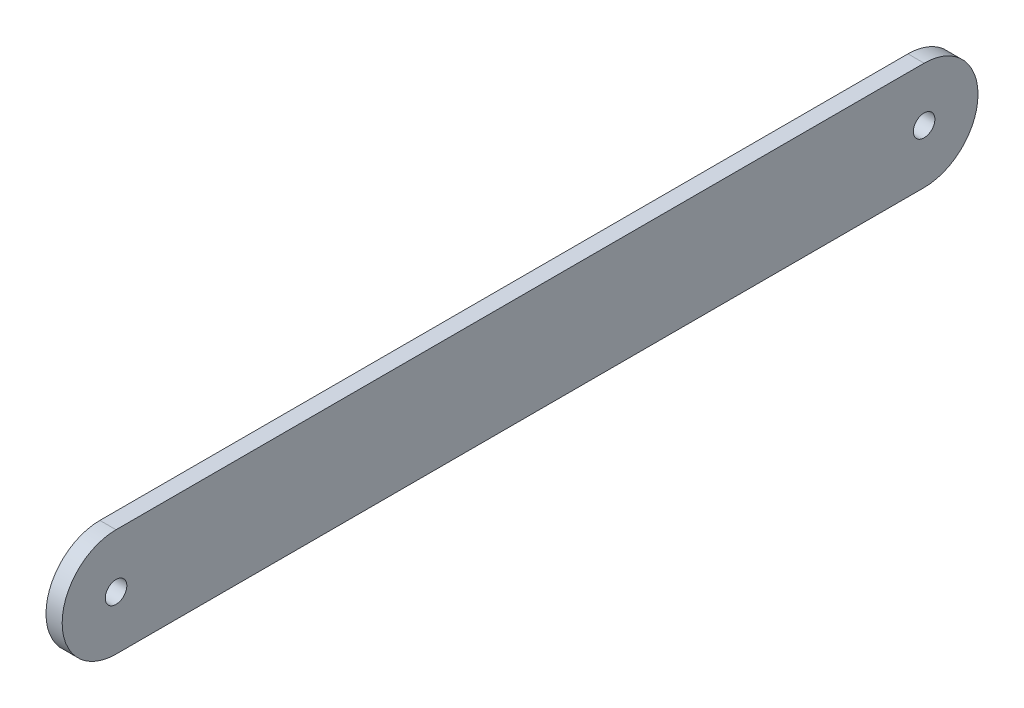
ISO-10303-21;
HEADER;
FILE_DESCRIPTION(('STEP AP214'),'2;1');
FILE_NAME('part.step','',(''),(''),'','','');
FILE_SCHEMA(('AUTOMOTIVE_DESIGN { 1 0 10303 214 1 1 1 1 }'));
ENDSEC;
DATA;
#1=APPLICATION_CONTEXT('core data for automotive mechanical design processes');
#2=APPLICATION_PROTOCOL_DEFINITION('international standard','automotive_design',2000,#1);
#3=PRODUCT_CONTEXT('',#1,'mechanical');
#4=PRODUCT('Part','Part','',(#3));
#5=PRODUCT_RELATED_PRODUCT_CATEGORY('part','',(#4));
#6=PRODUCT_DEFINITION_FORMATION('','',#4);
#7=PRODUCT_DEFINITION_CONTEXT('part definition',#1,'design');
#8=PRODUCT_DEFINITION('design','',#6,#7);
#9=PRODUCT_DEFINITION_SHAPE('','',#8);
#10=(LENGTH_UNIT() NAMED_UNIT(*) SI_UNIT(.MILLI.,.METRE.));
#11=(NAMED_UNIT(*) PLANE_ANGLE_UNIT() SI_UNIT($,.RADIAN.));
#12=(NAMED_UNIT(*) SI_UNIT($,.STERADIAN.) SOLID_ANGLE_UNIT());
#13=UNCERTAINTY_MEASURE_WITH_UNIT(LENGTH_MEASURE(1.E-05),#10,'distance_accuracy_value','');
#14=(GEOMETRIC_REPRESENTATION_CONTEXT(3) GLOBAL_UNCERTAINTY_ASSIGNED_CONTEXT((#13)) GLOBAL_UNIT_ASSIGNED_CONTEXT((#10,
#11,#12)) REPRESENTATION_CONTEXT('',''));
#15=CARTESIAN_POINT('',(0.,0.,0.));
#16=DIRECTION('',(0.,0.,1.));
#17=DIRECTION('',(1.,0.,0.));
#18=AXIS2_PLACEMENT_3D('',#15,#16,#17);
#19=CARTESIAN_POINT('',(3.,0.,75.));
#20=DIRECTION('',(1.,0.,0.));
#21=DIRECTION('',(0.,0.,-1.));
#22=AXIS2_PLACEMENT_3D('',#19,#20,#21);
#23=PLANE('',#22);
#24=CARTESIAN_POINT('',(3.,0.,75.));
#25=DIRECTION('',(1.,0.,0.));
#26=DIRECTION('',(0.,0.,-1.));
#27=AXIS2_PLACEMENT_3D('',#24,#25,#26);
#28=CIRCLE('',#27,2.);
#29=CARTESIAN_POINT('',(3.,0.,73.));
#30=VERTEX_POINT('',#29);
#31=EDGE_CURVE('E100',#30,#30,#28,.T.);
#32=ORIENTED_EDGE('',*,*,#31,.F.);
#33=EDGE_LOOP('',(#32));
#34=FACE_BOUND('',#33,.T.);
#35=CARTESIAN_POINT('',(3.,0.,75.));
#36=DIRECTION('',(1.,0.,0.));
#37=DIRECTION('',(0.,0.,-1.));
#38=AXIS2_PLACEMENT_3D('',#35,#36,#37);
#39=CIRCLE('',#38,10.);
#40=CARTESIAN_POINT('',(3.,10.,75.));
#41=VERTEX_POINT('',#40);
#42=CARTESIAN_POINT('',(3.,-10.,75.));
#43=VERTEX_POINT('',#42);
#44=EDGE_CURVE('E85',#41,#43,#39,.T.);
#45=ORIENTED_EDGE('',*,*,#44,.T.);
#46=DIRECTION('',(0.,0.,-1.));
#47=VECTOR('',#46,1.);
#48=CARTESIAN_POINT('',(3.,-10.,75.));
#49=LINE('',#48,#47);
#50=CARTESIAN_POINT('',(3.,-9.99999999999997,-75.));
#51=VERTEX_POINT('',#50);
#52=EDGE_CURVE('E80',#43,#51,#49,.T.);
#53=ORIENTED_EDGE('',*,*,#52,.T.);
#54=CARTESIAN_POINT('',(3.,0.,-75.));
#55=DIRECTION('',(1.,0.,0.));
#56=DIRECTION('',(0.,0.,-1.));
#57=AXIS2_PLACEMENT_3D('',#54,#55,#56);
#58=CIRCLE('',#57,10.);
#59=CARTESIAN_POINT('',(3.,10.,-75.));
#60=VERTEX_POINT('',#59);
#61=EDGE_CURVE('E83',#51,#60,#58,.T.);
#62=ORIENTED_EDGE('',*,*,#61,.T.);
#63=DIRECTION('',(0.,0.,1.));
#64=VECTOR('',#63,1.);
#65=CARTESIAN_POINT('',(3.,10.,75.));
#66=LINE('',#65,#64);
#67=EDGE_CURVE('E50',#60,#41,#66,.T.);
#68=ORIENTED_EDGE('',*,*,#67,.T.);
#69=EDGE_LOOP('',(#45,#53,#62,#68));
#70=FACE_BOUND('',#69,.T.);
#71=CARTESIAN_POINT('',(3.,0.,-75.));
#72=DIRECTION('',(1.,0.,0.));
#73=DIRECTION('',(0.,0.,-1.));
#74=AXIS2_PLACEMENT_3D('',#71,#72,#73);
#75=CIRCLE('',#74,2.);
#76=CARTESIAN_POINT('',(3.,0.,-77.));
#77=VERTEX_POINT('',#76);
#78=EDGE_CURVE('E115',#77,#77,#75,.T.);
#79=ORIENTED_EDGE('',*,*,#78,.F.);
#80=EDGE_LOOP('',(#79));
#81=FACE_BOUND('',#80,.T.);
#82=ADVANCED_FACE('F33',(#34,#70,#81),#23,.T.);
#83=CARTESIAN_POINT('',(0.,0.,75.));
#84=DIRECTION('',(1.,0.,0.));
#85=DIRECTION('',(0.,0.,-1.));
#86=AXIS2_PLACEMENT_3D('',#83,#84,#85);
#87=PLANE('',#86);
#88=CARTESIAN_POINT('',(0.,0.,75.));
#89=DIRECTION('',(1.,0.,0.));
#90=DIRECTION('',(0.,0.,-1.));
#91=AXIS2_PLACEMENT_3D('',#88,#89,#90);
#92=CIRCLE('',#91,10.);
#93=CARTESIAN_POINT('',(0.,10.,75.));
#94=VERTEX_POINT('',#93);
#95=CARTESIAN_POINT('',(0.,-10.,75.));
#96=VERTEX_POINT('',#95);
#97=EDGE_CURVE('E97',#94,#96,#92,.T.);
#98=ORIENTED_EDGE('',*,*,#97,.F.);
#99=DIRECTION('',(0.,0.,1.));
#100=VECTOR('',#99,1.);
#101=CARTESIAN_POINT('',(0.,10.,75.));
#102=LINE('',#101,#100);
#103=CARTESIAN_POINT('',(0.,10.,-75.));
#104=VERTEX_POINT('',#103);
#105=EDGE_CURVE('E73',#104,#94,#102,.T.);
#106=ORIENTED_EDGE('',*,*,#105,.F.);
#107=CARTESIAN_POINT('',(0.,0.,-75.));
#108=DIRECTION('',(1.,0.,0.));
#109=DIRECTION('',(0.,0.,-1.));
#110=AXIS2_PLACEMENT_3D('',#107,#108,#109);
#111=CIRCLE('',#110,10.);
#112=CARTESIAN_POINT('',(0.,-9.99999999999997,-75.));
#113=VERTEX_POINT('',#112);
#114=EDGE_CURVE('E67',#113,#104,#111,.T.);
#115=ORIENTED_EDGE('',*,*,#114,.F.);
#116=DIRECTION('',(0.,0.,-1.));
#117=VECTOR('',#116,1.);
#118=CARTESIAN_POINT('',(0.,-10.,75.));
#119=LINE('',#118,#117);
#120=EDGE_CURVE('E89',#96,#113,#119,.T.);
#121=ORIENTED_EDGE('',*,*,#120,.F.);
#122=EDGE_LOOP('',(#98,#106,#115,#121));
#123=FACE_BOUND('',#122,.T.);
#124=CARTESIAN_POINT('',(0.,0.,75.));
#125=DIRECTION('',(1.,0.,0.));
#126=DIRECTION('',(0.,0.,-1.));
#127=AXIS2_PLACEMENT_3D('',#124,#125,#126);
#128=CIRCLE('',#127,2.);
#129=CARTESIAN_POINT('',(0.,0.,73.));
#130=VERTEX_POINT('',#129);
#131=EDGE_CURVE('E112',#130,#130,#128,.T.);
#132=ORIENTED_EDGE('',*,*,#131,.T.);
#133=EDGE_LOOP('',(#132));
#134=FACE_BOUND('',#133,.T.);
#135=CARTESIAN_POINT('',(0.,0.,-75.));
#136=DIRECTION('',(1.,0.,0.));
#137=DIRECTION('',(0.,0.,-1.));
#138=AXIS2_PLACEMENT_3D('',#135,#136,#137);
#139=CIRCLE('',#138,2.);
#140=CARTESIAN_POINT('',(0.,0.,-77.));
#141=VERTEX_POINT('',#140);
#142=EDGE_CURVE('E118',#141,#141,#139,.T.);
#143=ORIENTED_EDGE('',*,*,#142,.T.);
#144=EDGE_LOOP('',(#143));
#145=FACE_BOUND('',#144,.T.);
#146=ADVANCED_FACE('F108',(#123,#134,#145),#87,.F.);
#147=CARTESIAN_POINT('',(3.,0.,75.));
#148=DIRECTION('',(-1.,0.,0.));
#149=DIRECTION('',(0.,0.,1.));
#150=AXIS2_PLACEMENT_3D('',#147,#148,#149);
#151=CYLINDRICAL_SURFACE('',#150,10.);
#152=ORIENTED_EDGE('',*,*,#97,.T.);
#153=DIRECTION('',(-1.,0.,0.));
#154=VECTOR('',#153,1.);
#155=CARTESIAN_POINT('',(3.,-10.,75.));
#156=LINE('',#155,#154);
#157=EDGE_CURVE('E11',#43,#96,#156,.T.);
#158=ORIENTED_EDGE('',*,*,#157,.F.);
#159=ORIENTED_EDGE('',*,*,#44,.F.);
#160=DIRECTION('',(-1.,0.,0.));
#161=VECTOR('',#160,1.);
#162=CARTESIAN_POINT('',(3.,10.,75.));
#163=LINE('',#162,#161);
#164=EDGE_CURVE('E93',#41,#94,#163,.T.);
#165=ORIENTED_EDGE('',*,*,#164,.T.);
#166=EDGE_LOOP('',(#152,#158,#159,#165));
#167=FACE_BOUND('',#166,.T.);
#168=ADVANCED_FACE('F35',(#167),#151,.T.);
#169=CARTESIAN_POINT('',(3.,-10.,75.));
#170=DIRECTION('',(0.,1.,0.));
#171=DIRECTION('',(0.,0.,1.));
#172=AXIS2_PLACEMENT_3D('',#169,#170,#171);
#173=PLANE('',#172);
#174=ORIENTED_EDGE('',*,*,#120,.T.);
#175=DIRECTION('',(-1.,0.,0.));
#176=VECTOR('',#175,1.);
#177=CARTESIAN_POINT('',(3.,-9.99999999999997,-75.));
#178=LINE('',#177,#176);
#179=EDGE_CURVE('E42',#51,#113,#178,.T.);
#180=ORIENTED_EDGE('',*,*,#179,.F.);
#181=ORIENTED_EDGE('',*,*,#52,.F.);
#182=ORIENTED_EDGE('',*,*,#157,.T.);
#183=EDGE_LOOP('',(#174,#180,#181,#182));
#184=FACE_BOUND('',#183,.T.);
#185=ADVANCED_FACE('F88',(#184),#173,.F.);
#186=CARTESIAN_POINT('',(3.,0.,-75.));
#187=DIRECTION('',(-1.,0.,0.));
#188=DIRECTION('',(0.,0.,1.));
#189=AXIS2_PLACEMENT_3D('',#186,#187,#188);
#190=CYLINDRICAL_SURFACE('',#189,10.);
#191=ORIENTED_EDGE('',*,*,#114,.T.);
#192=DIRECTION('',(-1.,0.,0.));
#193=VECTOR('',#192,1.);
#194=CARTESIAN_POINT('',(3.,10.,-75.));
#195=LINE('',#194,#193);
#196=EDGE_CURVE('E90',#60,#104,#195,.T.);
#197=ORIENTED_EDGE('',*,*,#196,.F.);
#198=ORIENTED_EDGE('',*,*,#61,.F.);
#199=ORIENTED_EDGE('',*,*,#179,.T.);
#200=EDGE_LOOP('',(#191,#197,#198,#199));
#201=FACE_BOUND('',#200,.T.);
#202=ADVANCED_FACE('F91',(#201),#190,.T.);
#203=CARTESIAN_POINT('',(3.,10.,75.));
#204=DIRECTION('',(0.,-1.,0.));
#205=DIRECTION('',(0.,0.,-1.));
#206=AXIS2_PLACEMENT_3D('',#203,#204,#205);
#207=PLANE('',#206);
#208=ORIENTED_EDGE('',*,*,#105,.T.);
#209=ORIENTED_EDGE('',*,*,#164,.F.);
#210=ORIENTED_EDGE('',*,*,#67,.F.);
#211=ORIENTED_EDGE('',*,*,#196,.T.);
#212=EDGE_LOOP('',(#208,#209,#210,#211));
#213=FACE_BOUND('',#212,.T.);
#214=ADVANCED_FACE('F105',(#213),#207,.F.);
#215=CARTESIAN_POINT('',(3.,0.,75.));
#216=DIRECTION('',(-1.,0.,0.));
#217=DIRECTION('',(0.,0.,1.));
#218=AXIS2_PLACEMENT_3D('',#215,#216,#217);
#219=CYLINDRICAL_SURFACE('',#218,2.);
#220=ORIENTED_EDGE('',*,*,#31,.T.);
#221=EDGE_LOOP('',(#220));
#222=FACE_BOUND('',#221,.T.);
#223=ORIENTED_EDGE('',*,*,#131,.F.);
#224=EDGE_LOOP('',(#223));
#225=FACE_BOUND('',#224,.T.);
#226=ADVANCED_FACE('F135',(#222,#225),#219,.F.);
#227=CARTESIAN_POINT('',(3.,0.,-75.));
#228=DIRECTION('',(-1.,0.,0.));
#229=DIRECTION('',(0.,0.,1.));
#230=AXIS2_PLACEMENT_3D('',#227,#228,#229);
#231=CYLINDRICAL_SURFACE('',#230,2.);
#232=ORIENTED_EDGE('',*,*,#78,.T.);
#233=EDGE_LOOP('',(#232));
#234=FACE_BOUND('',#233,.T.);
#235=ORIENTED_EDGE('',*,*,#142,.F.);
#236=EDGE_LOOP('',(#235));
#237=FACE_BOUND('',#236,.T.);
#238=ADVANCED_FACE('F124',(#234,#237),#231,.F.);
#239=CLOSED_SHELL('',(#82,#146,#168,#185,#202,#214,#226,#238));
#240=MANIFOLD_SOLID_BREP('B2',#239);
#241=ADVANCED_BREP_SHAPE_REPRESENTATION('',(#18,#240),#14);
#242=SHAPE_DEFINITION_REPRESENTATION(#9,#241);
ENDSEC;
END-ISO-10303-21;
